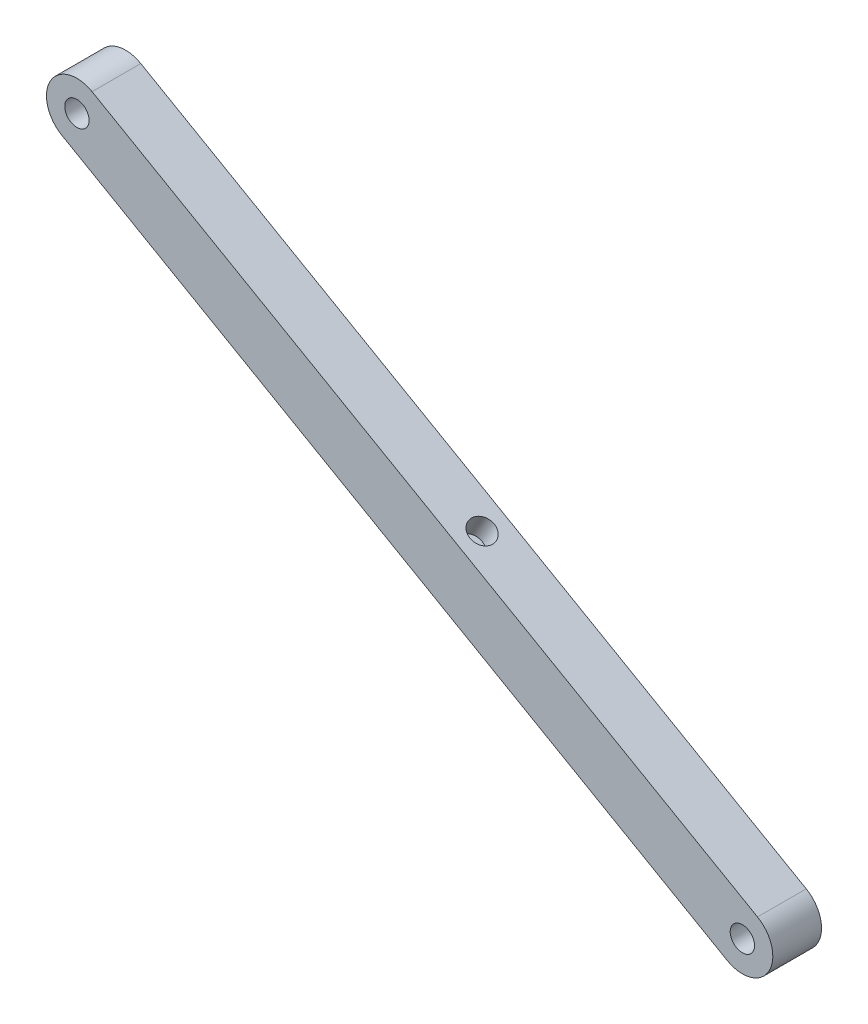
ISO-10303-21;
HEADER;
FILE_DESCRIPTION(('STEP AP214'),'2;1');
FILE_NAME('part.step','',(''),(''),'','','');
FILE_SCHEMA(('AUTOMOTIVE_DESIGN { 1 0 10303 214 1 1 1 1 }'));
ENDSEC;
DATA;
#1=APPLICATION_CONTEXT('core data for automotive mechanical design processes');
#2=APPLICATION_PROTOCOL_DEFINITION('international standard','automotive_design',2000,#1);
#3=PRODUCT_CONTEXT('',#1,'mechanical');
#4=PRODUCT('Part','Part','',(#3));
#5=PRODUCT_RELATED_PRODUCT_CATEGORY('part','',(#4));
#6=PRODUCT_DEFINITION_FORMATION('','',#4);
#7=PRODUCT_DEFINITION_CONTEXT('part definition',#1,'design');
#8=PRODUCT_DEFINITION('design','',#6,#7);
#9=PRODUCT_DEFINITION_SHAPE('','',#8);
#10=(LENGTH_UNIT() NAMED_UNIT(*) SI_UNIT(.MILLI.,.METRE.));
#11=(NAMED_UNIT(*) PLANE_ANGLE_UNIT() SI_UNIT($,.RADIAN.));
#12=(NAMED_UNIT(*) SI_UNIT($,.STERADIAN.) SOLID_ANGLE_UNIT());
#13=UNCERTAINTY_MEASURE_WITH_UNIT(LENGTH_MEASURE(1.E-05),#10,'distance_accuracy_value','');
#14=(GEOMETRIC_REPRESENTATION_CONTEXT(3) GLOBAL_UNCERTAINTY_ASSIGNED_CONTEXT((#13)) GLOBAL_UNIT_ASSIGNED_CONTEXT((#10,
#11,#12)) REPRESENTATION_CONTEXT('',''));
#15=CARTESIAN_POINT('',(0.,0.,0.));
#16=DIRECTION('',(0.,0.,1.));
#17=DIRECTION('',(1.,0.,0.));
#18=AXIS2_PLACEMENT_3D('',#15,#16,#17);
#19=CARTESIAN_POINT('',(-59.9030270498132,62.4083679232232,4.));
#20=DIRECTION('',(0.,0.,1.));
#21=DIRECTION('',(1.,0.,0.));
#22=AXIS2_PLACEMENT_3D('',#19,#20,#21);
#23=PLANE('',#22);
#24=CARTESIAN_POINT('',(-59.9030270498132,62.4083679232232,4.));
#25=DIRECTION('',(0.,0.,1.));
#26=DIRECTION('',(1.,0.,0.));
#27=AXIS2_PLACEMENT_3D('',#24,#25,#26);
#28=CIRCLE('',#27,0.999999999999996);
#29=CARTESIAN_POINT('',(-58.9030270498132,62.4083679232232,4.));
#30=VERTEX_POINT('',#29);
#31=EDGE_CURVE('E112',#30,#30,#28,.T.);
#32=ORIENTED_EDGE('',*,*,#31,.F.);
#33=EDGE_LOOP('',(#32));
#34=FACE_BOUND('',#33,.T.);
#35=CARTESIAN_POINT('',(-59.9030270498132,62.4083679232232,4.));
#36=DIRECTION('',(0.,0.,1.));
#37=DIRECTION('',(1.,0.,0.));
#38=AXIS2_PLACEMENT_3D('',#35,#36,#37);
#39=CIRCLE('',#38,2.5);
#40=CARTESIAN_POINT('',(-58.6584342064155,64.5765442661813,4.));
#41=VERTEX_POINT('',#40);
#42=CARTESIAN_POINT('',(-61.1476198932109,60.2401915802651,4.));
#43=VERTEX_POINT('',#42);
#44=EDGE_CURVE('E92',#41,#43,#39,.T.);
#45=ORIENTED_EDGE('',*,*,#44,.T.);
#46=DIRECTION('',(0.867270537183245,-0.497837137359081,0.));
#47=VECTOR('',#46,1.);
#48=CARTESIAN_POINT('',(-61.1476198932109,60.2401915802651,4.));
#49=LINE('',#48,#47);
#50=CARTESIAN_POINT('',(-6.50957605066647,28.876451926643,4.));
#51=VERTEX_POINT('',#50);
#52=EDGE_CURVE('E87',#43,#51,#49,.T.);
#53=ORIENTED_EDGE('',*,*,#52,.T.);
#54=CARTESIAN_POINT('',(-5.26498320726877,31.0446282696011,4.));
#55=DIRECTION('',(0.,0.,1.));
#56=DIRECTION('',(1.,0.,0.));
#57=AXIS2_PLACEMENT_3D('',#54,#55,#56);
#58=CIRCLE('',#57,2.5);
#59=CARTESIAN_POINT('',(-4.02039036387106,33.2128046125592,4.));
#60=VERTEX_POINT('',#59);
#61=EDGE_CURVE('E90',#51,#60,#58,.T.);
#62=ORIENTED_EDGE('',*,*,#61,.T.);
#63=DIRECTION('',(-0.867270537183245,0.497837137359082,0.));
#64=VECTOR('',#63,1.);
#65=CARTESIAN_POINT('',(-58.6584342064155,64.5765442661813,4.));
#66=LINE('',#65,#64);
#67=EDGE_CURVE('E57',#60,#41,#66,.T.);
#68=ORIENTED_EDGE('',*,*,#67,.T.);
#69=EDGE_LOOP('',(#45,#53,#62,#68));
#70=FACE_BOUND('',#69,.T.);
#71=CARTESIAN_POINT('',(-5.26498320726877,31.0446282696011,4.));
#72=DIRECTION('',(0.,0.,1.));
#73=DIRECTION('',(1.,0.,0.));
#74=AXIS2_PLACEMENT_3D('',#71,#72,#73);
#75=CIRCLE('',#74,1.);
#76=CARTESIAN_POINT('',(-4.26498320726877,31.0446282696011,4.));
#77=VERTEX_POINT('',#76);
#78=EDGE_CURVE('E134',#77,#77,#75,.T.);
#79=ORIENTED_EDGE('',*,*,#78,.F.);
#80=EDGE_LOOP('',(#79));
#81=FACE_BOUND('',#80,.T.);
#82=ADVANCED_FACE('F39',(#34,#70,#81),#23,.T.);
#83=CARTESIAN_POINT('',(-59.9030270498132,62.4083679232232,0.));
#84=DIRECTION('',(0.,0.,1.));
#85=DIRECTION('',(1.,0.,0.));
#86=AXIS2_PLACEMENT_3D('',#83,#84,#85);
#87=PLANE('',#86);
#88=CARTESIAN_POINT('',(-59.9030270498132,62.4083679232232,0.));
#89=DIRECTION('',(0.,0.,1.));
#90=DIRECTION('',(1.,0.,0.));
#91=AXIS2_PLACEMENT_3D('',#88,#89,#90);
#92=CIRCLE('',#91,2.5);
#93=CARTESIAN_POINT('',(-58.6584342064155,64.5765442661813,0.));
#94=VERTEX_POINT('',#93);
#95=CARTESIAN_POINT('',(-61.1476198932109,60.2401915802651,0.));
#96=VERTEX_POINT('',#95);
#97=EDGE_CURVE('E108',#94,#96,#92,.T.);
#98=ORIENTED_EDGE('',*,*,#97,.F.);
#99=DIRECTION('',(-0.867270537183245,0.497837137359082,0.));
#100=VECTOR('',#99,1.);
#101=CARTESIAN_POINT('',(-58.6584342064155,64.5765442661813,0.));
#102=LINE('',#101,#100);
#103=CARTESIAN_POINT('',(-4.02039036387106,33.2128046125592,0.));
#104=VERTEX_POINT('',#103);
#105=EDGE_CURVE('E80',#104,#94,#102,.T.);
#106=ORIENTED_EDGE('',*,*,#105,.F.);
#107=CARTESIAN_POINT('',(-5.26498320726877,31.0446282696011,0.));
#108=DIRECTION('',(0.,0.,1.));
#109=DIRECTION('',(1.,0.,0.));
#110=AXIS2_PLACEMENT_3D('',#107,#108,#109);
#111=CIRCLE('',#110,2.5);
#112=CARTESIAN_POINT('',(-6.50957605066647,28.876451926643,0.));
#113=VERTEX_POINT('',#112);
#114=EDGE_CURVE('E74',#113,#104,#111,.T.);
#115=ORIENTED_EDGE('',*,*,#114,.F.);
#116=DIRECTION('',(0.867270537183245,-0.497837137359081,0.));
#117=VECTOR('',#116,1.);
#118=CARTESIAN_POINT('',(-61.1476198932109,60.2401915802651,0.));
#119=LINE('',#118,#117);
#120=EDGE_CURVE('E97',#96,#113,#119,.T.);
#121=ORIENTED_EDGE('',*,*,#120,.F.);
#122=EDGE_LOOP('',(#98,#106,#115,#121));
#123=FACE_BOUND('',#122,.T.);
#124=CARTESIAN_POINT('',(-59.9030270498132,62.4083679232232,0.));
#125=DIRECTION('',(0.,0.,1.));
#126=DIRECTION('',(1.,0.,0.));
#127=AXIS2_PLACEMENT_3D('',#124,#125,#126);
#128=CIRCLE('',#127,0.999999999999996);
#129=CARTESIAN_POINT('',(-58.9030270498132,62.4083679232232,0.));
#130=VERTEX_POINT('',#129);
#131=EDGE_CURVE('E130',#130,#130,#128,.T.);
#132=ORIENTED_EDGE('',*,*,#131,.T.);
#133=EDGE_LOOP('',(#132));
#134=FACE_BOUND('',#133,.T.);
#135=CARTESIAN_POINT('',(-5.26498320726877,31.0446282696011,0.));
#136=DIRECTION('',(0.,0.,1.));
#137=DIRECTION('',(1.,0.,0.));
#138=AXIS2_PLACEMENT_3D('',#135,#136,#137);
#139=CIRCLE('',#138,1.);
#140=CARTESIAN_POINT('',(-4.26498320726877,31.0446282696011,0.));
#141=VERTEX_POINT('',#140);
#142=EDGE_CURVE('E138',#141,#141,#139,.T.);
#143=ORIENTED_EDGE('',*,*,#142,.T.);
#144=EDGE_LOOP('',(#143));
#145=FACE_BOUND('',#144,.T.);
#146=ADVANCED_FACE('F125',(#123,#134,#145),#87,.F.);
#147=CARTESIAN_POINT('',(-59.9030270498132,62.4083679232232,4.));
#148=DIRECTION('',(0.,0.,-1.));
#149=DIRECTION('',(-1.,0.,0.));
#150=AXIS2_PLACEMENT_3D('',#147,#148,#149);
#151=CYLINDRICAL_SURFACE('',#150,2.5);
#152=ORIENTED_EDGE('',*,*,#97,.T.);
#153=DIRECTION('',(0.,0.,-1.));
#154=VECTOR('',#153,1.);
#155=CARTESIAN_POINT('',(-61.1476198932109,60.2401915802651,4.));
#156=LINE('',#155,#154);
#157=EDGE_CURVE('E11',#43,#96,#156,.T.);
#158=ORIENTED_EDGE('',*,*,#157,.F.);
#159=ORIENTED_EDGE('',*,*,#44,.F.);
#160=DIRECTION('',(0.,0.,-1.));
#161=VECTOR('',#160,1.);
#162=CARTESIAN_POINT('',(-58.6584342064155,64.5765442661813,4.));
#163=LINE('',#162,#161);
#164=EDGE_CURVE('E104',#41,#94,#163,.T.);
#165=ORIENTED_EDGE('',*,*,#164,.T.);
#166=EDGE_LOOP('',(#152,#158,#159,#165));
#167=FACE_BOUND('',#166,.T.);
#168=ADVANCED_FACE('F41',(#167),#151,.T.);
#169=CARTESIAN_POINT('',(-61.1476198932109,60.2401915802651,4.));
#170=DIRECTION('',(0.497837137359081,0.867270537183245,0.));
#171=DIRECTION('',(-0.867270537183245,0.497837137359081,0.));
#172=AXIS2_PLACEMENT_3D('',#169,#170,#171);
#173=PLANE('',#172);
#174=ORIENTED_EDGE('',*,*,#120,.T.);
#175=DIRECTION('',(0.,0.,-1.));
#176=VECTOR('',#175,1.);
#177=CARTESIAN_POINT('',(-6.50957605066647,28.876451926643,4.));
#178=LINE('',#177,#176);
#179=EDGE_CURVE('E49',#51,#113,#178,.T.);
#180=ORIENTED_EDGE('',*,*,#179,.F.);
#181=ORIENTED_EDGE('',*,*,#52,.F.);
#182=ORIENTED_EDGE('',*,*,#157,.T.);
#183=EDGE_LOOP('',(#174,#180,#181,#182));
#184=FACE_BOUND('',#183,.T.);
#185=ADVANCED_FACE('F96',(#184),#173,.F.);
#186=CARTESIAN_POINT('',(-5.26498320726877,31.0446282696011,4.));
#187=DIRECTION('',(0.,0.,-1.));
#188=DIRECTION('',(-1.,0.,0.));
#189=AXIS2_PLACEMENT_3D('',#186,#187,#188);
#190=CYLINDRICAL_SURFACE('',#189,2.5);
#191=ORIENTED_EDGE('',*,*,#114,.T.);
#192=DIRECTION('',(0.,0.,-1.));
#193=VECTOR('',#192,1.);
#194=CARTESIAN_POINT('',(-4.02039036387106,33.2128046125592,4.));
#195=LINE('',#194,#193);
#196=EDGE_CURVE('E99',#60,#104,#195,.T.);
#197=ORIENTED_EDGE('',*,*,#196,.F.);
#198=ORIENTED_EDGE('',*,*,#61,.F.);
#199=ORIENTED_EDGE('',*,*,#179,.T.);
#200=EDGE_LOOP('',(#191,#197,#198,#199));
#201=FACE_BOUND('',#200,.T.);
#202=ADVANCED_FACE('F100',(#201),#190,.T.);
#203=CARTESIAN_POINT('',(-58.6584342064155,64.5765442661813,4.));
#204=DIRECTION('',(-0.497837137359082,-0.867270537183245,0.));
#205=DIRECTION('',(0.867270537183245,-0.497837137359082,0.));
#206=AXIS2_PLACEMENT_3D('',#203,#204,#205);
#207=PLANE('',#206);
#208=CARTESIAN_POINT('',(-28.635584917886,47.3426031781923,2.));
#209=DIRECTION('',(0.497837137359081,0.867270537183246,0.));
#210=DIRECTION('',(-0.867270537183246,0.497837137359081,0.));
#211=AXIS2_PLACEMENT_3D('',#208,#209,#210);
#212=CIRCLE('',#211,0.999999999999992);
#213=CARTESIAN_POINT('',(-29.5028554550693,47.8404403155514,2.));
#214=VERTEX_POINT('',#213);
#215=EDGE_CURVE('E146',#214,#214,#212,.T.);
#216=ORIENTED_EDGE('',*,*,#215,.F.);
#217=EDGE_LOOP('',(#216));
#218=FACE_BOUND('',#217,.T.);
#219=ORIENTED_EDGE('',*,*,#105,.T.);
#220=ORIENTED_EDGE('',*,*,#164,.F.);
#221=ORIENTED_EDGE('',*,*,#67,.F.);
#222=ORIENTED_EDGE('',*,*,#196,.T.);
#223=EDGE_LOOP('',(#219,#220,#221,#222));
#224=FACE_BOUND('',#223,.T.);
#225=ADVANCED_FACE('F122',(#218,#224),#207,.F.);
#226=CARTESIAN_POINT('',(-59.9030270498132,62.4083679232232,4.));
#227=DIRECTION('',(0.,0.,-1.));
#228=DIRECTION('',(-1.,0.,0.));
#229=AXIS2_PLACEMENT_3D('',#226,#227,#228);
#230=CYLINDRICAL_SURFACE('',#229,0.999999999999996);
#231=ORIENTED_EDGE('',*,*,#31,.T.);
#232=EDGE_LOOP('',(#231));
#233=FACE_BOUND('',#232,.T.);
#234=ORIENTED_EDGE('',*,*,#131,.F.);
#235=EDGE_LOOP('',(#234));
#236=FACE_BOUND('',#235,.T.);
#237=ADVANCED_FACE('F164',(#233,#236),#230,.F.);
#238=CARTESIAN_POINT('',(-5.26498320726877,31.0446282696011,4.));
#239=DIRECTION('',(0.,0.,-1.));
#240=DIRECTION('',(-1.,0.,0.));
#241=AXIS2_PLACEMENT_3D('',#238,#239,#240);
#242=CYLINDRICAL_SURFACE('',#241,1.);
#243=ORIENTED_EDGE('',*,*,#78,.T.);
#244=EDGE_LOOP('',(#243));
#245=FACE_BOUND('',#244,.T.);
#246=ORIENTED_EDGE('',*,*,#142,.F.);
#247=EDGE_LOOP('',(#246));
#248=FACE_BOUND('',#247,.T.);
#249=ADVANCED_FACE('F159',(#245,#248),#242,.F.);
#250=CARTESIAN_POINT('',(-29.6312591926042,45.6080621038258,2.));
#251=DIRECTION('',(0.497837137359081,0.867270537183246,0.));
#252=DIRECTION('',(-0.867270537183246,0.497837137359081,0.));
#253=AXIS2_PLACEMENT_3D('',#250,#251,#252);
#254=CYLINDRICAL_SURFACE('',#253,0.999999999999992);
#255=CARTESIAN_POINT('',(-29.6312591926042,45.6080621038258,2.));
#256=DIRECTION('',(0.497837137359081,0.867270537183246,0.));
#257=DIRECTION('',(-0.867270537183246,0.497837137359081,0.));
#258=AXIS2_PLACEMENT_3D('',#255,#256,#257);
#259=CIRCLE('',#258,0.999999999999992);
#260=CARTESIAN_POINT('',(-30.4985297297874,46.1058992411849,2.));
#261=VERTEX_POINT('',#260);
#262=EDGE_CURVE('E142',#261,#261,#259,.T.);
#263=ORIENTED_EDGE('',*,*,#262,.F.);
#264=EDGE_LOOP('',(#263));
#265=FACE_BOUND('',#264,.T.);
#266=ORIENTED_EDGE('',*,*,#215,.T.);
#267=EDGE_LOOP('',(#266));
#268=FACE_BOUND('',#267,.T.);
#269=ADVANCED_FACE('F156',(#265,#268),#254,.F.);
#270=CARTESIAN_POINT('',(-29.6312591926042,45.6080621038258,2.));
#271=DIRECTION('',(0.497837137359081,0.867270537183246,0.));
#272=DIRECTION('',(-0.867270537183246,0.497837137359081,0.));
#273=AXIS2_PLACEMENT_3D('',#270,#271,#272);
#274=PLANE('',#273);
#275=ORIENTED_EDGE('',*,*,#262,.T.);
#276=EDGE_LOOP('',(#275));
#277=FACE_BOUND('',#276,.T.);
#278=ADVANCED_FACE('F154',(#277),#274,.T.);
#279=CLOSED_SHELL('',(#82,#146,#168,#185,#202,#225,#237,#249,#269,#278));
#280=MANIFOLD_SOLID_BREP('B2',#279);
#281=ADVANCED_BREP_SHAPE_REPRESENTATION('',(#18,#280),#14);
#282=SHAPE_DEFINITION_REPRESENTATION(#9,#281);
ENDSEC;
END-ISO-10303-21;
